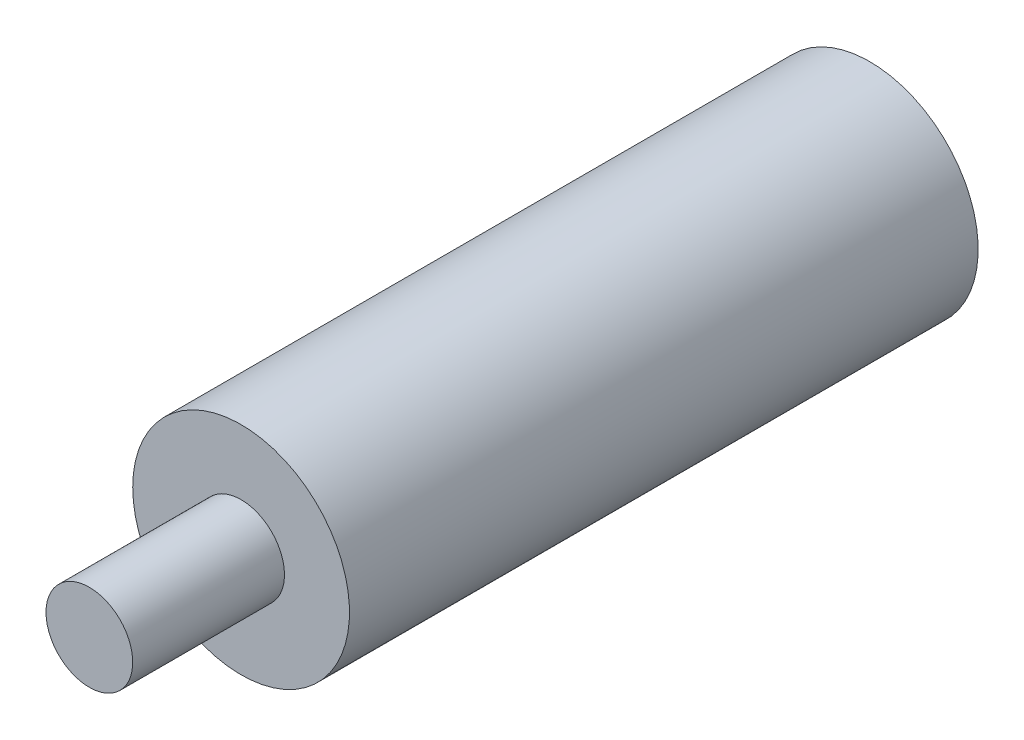
ISO-10303-21;
HEADER;
FILE_DESCRIPTION(('STEP AP214'),'2;1');
FILE_NAME('part.step','',(''),(''),'','','');
FILE_SCHEMA(('AUTOMOTIVE_DESIGN { 1 0 10303 214 1 1 1 1 }'));
ENDSEC;
DATA;
#1=APPLICATION_CONTEXT('core data for automotive mechanical design processes');
#2=APPLICATION_PROTOCOL_DEFINITION('international standard','automotive_design',2000,#1);
#3=PRODUCT_CONTEXT('',#1,'mechanical');
#4=PRODUCT('Part','Part','',(#3));
#5=PRODUCT_RELATED_PRODUCT_CATEGORY('part','',(#4));
#6=PRODUCT_DEFINITION_FORMATION('','',#4);
#7=PRODUCT_DEFINITION_CONTEXT('part definition',#1,'design');
#8=PRODUCT_DEFINITION('design','',#6,#7);
#9=PRODUCT_DEFINITION_SHAPE('','',#8);
#10=(LENGTH_UNIT() NAMED_UNIT(*) SI_UNIT(.MILLI.,.METRE.));
#11=(NAMED_UNIT(*) PLANE_ANGLE_UNIT() SI_UNIT($,.RADIAN.));
#12=(NAMED_UNIT(*) SI_UNIT($,.STERADIAN.) SOLID_ANGLE_UNIT());
#13=UNCERTAINTY_MEASURE_WITH_UNIT(LENGTH_MEASURE(1.E-05),#10,'distance_accuracy_value','');
#14=(GEOMETRIC_REPRESENTATION_CONTEXT(3) GLOBAL_UNCERTAINTY_ASSIGNED_CONTEXT((#13)) GLOBAL_UNIT_ASSIGNED_CONTEXT((#10,
#11,#12)) REPRESENTATION_CONTEXT('',''));
#15=CARTESIAN_POINT('',(0.,0.,0.));
#16=DIRECTION('',(0.,0.,1.));
#17=DIRECTION('',(1.,0.,0.));
#18=AXIS2_PLACEMENT_3D('',#15,#16,#17);
#19=CARTESIAN_POINT('',(0.,0.,0.));
#20=DIRECTION('',(0.,0.,1.));
#21=DIRECTION('',(1.,0.,0.));
#22=AXIS2_PLACEMENT_3D('',#19,#20,#21);
#23=PLANE('',#22);
#24=CARTESIAN_POINT('',(0.,0.,0.));
#25=DIRECTION('',(0.,0.,-1.));
#26=DIRECTION('',(-1.,0.,0.));
#27=AXIS2_PLACEMENT_3D('',#24,#25,#26);
#28=CIRCLE('',#27,9.99999999999998);
#29=CARTESIAN_POINT('',(-9.99999999999998,0.,0.));
#30=VERTEX_POINT('',#29);
#31=EDGE_CURVE('E10',#30,#30,#28,.T.);
#32=ORIENTED_EDGE('',*,*,#31,.F.);
#33=EDGE_LOOP('',(#32));
#34=FACE_BOUND('',#33,.T.);
#35=ADVANCED_FACE('F34',(#34),#23,.T.);
#36=CARTESIAN_POINT('',(0.,0.,-145.));
#37=DIRECTION('',(0.,0.,-1.));
#38=DIRECTION('',(-1.,0.,0.));
#39=AXIS2_PLACEMENT_3D('',#36,#37,#38);
#40=CYLINDRICAL_SURFACE('',#39,9.99999999999998);
#41=ORIENTED_EDGE('',*,*,#31,.T.);
#42=EDGE_LOOP('',(#41));
#43=FACE_BOUND('',#42,.T.);
#44=CARTESIAN_POINT('',(0.,0.,-35.));
#45=DIRECTION('',(0.,0.,-1.));
#46=DIRECTION('',(-1.,0.,0.));
#47=AXIS2_PLACEMENT_3D('',#44,#45,#46);
#48=CIRCLE('',#47,9.99999999999998);
#49=CARTESIAN_POINT('',(-9.99999999999998,0.,-35.));
#50=VERTEX_POINT('',#49);
#51=EDGE_CURVE('E41',#50,#50,#48,.T.);
#52=ORIENTED_EDGE('',*,*,#51,.F.);
#53=EDGE_LOOP('',(#52));
#54=FACE_BOUND('',#53,.T.);
#55=ADVANCED_FACE('F70',(#43,#54),#40,.T.);
#56=CARTESIAN_POINT('',(0.,9.99999999999998,-35.));
#57=DIRECTION('',(0.,0.,1.));
#58=DIRECTION('',(1.,0.,0.));
#59=AXIS2_PLACEMENT_3D('',#56,#57,#58);
#60=PLANE('',#59);
#61=ORIENTED_EDGE('',*,*,#51,.T.);
#62=EDGE_LOOP('',(#61));
#63=FACE_BOUND('',#62,.T.);
#64=CARTESIAN_POINT('',(0.,0.,-35.));
#65=DIRECTION('',(0.,0.,-1.));
#66=DIRECTION('',(-1.,0.,0.));
#67=AXIS2_PLACEMENT_3D('',#64,#65,#66);
#68=CIRCLE('',#67,25.);
#69=CARTESIAN_POINT('',(-25.,0.,-35.));
#70=VERTEX_POINT('',#69);
#71=EDGE_CURVE('E47',#70,#70,#68,.T.);
#72=ORIENTED_EDGE('',*,*,#71,.F.);
#73=EDGE_LOOP('',(#72));
#74=FACE_BOUND('',#73,.T.);
#75=ADVANCED_FACE('F62',(#63,#74),#60,.T.);
#76=CARTESIAN_POINT('',(0.,0.,-145.));
#77=DIRECTION('',(0.,0.,-1.));
#78=DIRECTION('',(-1.,0.,0.));
#79=AXIS2_PLACEMENT_3D('',#76,#77,#78);
#80=CYLINDRICAL_SURFACE('',#79,25.);
#81=ORIENTED_EDGE('',*,*,#71,.T.);
#82=EDGE_LOOP('',(#81));
#83=FACE_BOUND('',#82,.T.);
#84=CARTESIAN_POINT('',(0.,0.,-180.));
#85=DIRECTION('',(0.,0.,-1.));
#86=DIRECTION('',(-1.,0.,0.));
#87=AXIS2_PLACEMENT_3D('',#84,#85,#86);
#88=CIRCLE('',#87,25.);
#89=CARTESIAN_POINT('',(-25.,0.,-180.));
#90=VERTEX_POINT('',#89);
#91=EDGE_CURVE('E52',#90,#90,#88,.T.);
#92=ORIENTED_EDGE('',*,*,#91,.F.);
#93=EDGE_LOOP('',(#92));
#94=FACE_BOUND('',#93,.T.);
#95=ADVANCED_FACE('F60',(#83,#94),#80,.T.);
#96=CARTESIAN_POINT('',(0.,25.,-180.));
#97=DIRECTION('',(0.,0.,-1.));
#98=DIRECTION('',(-1.,0.,0.));
#99=AXIS2_PLACEMENT_3D('',#96,#97,#98);
#100=PLANE('',#99);
#101=ORIENTED_EDGE('',*,*,#91,.T.);
#102=EDGE_LOOP('',(#101));
#103=FACE_BOUND('',#102,.T.);
#104=ADVANCED_FACE('F58',(#103),#100,.T.);
#105=CLOSED_SHELL('',(#35,#55,#75,#95,#104));
#106=MANIFOLD_SOLID_BREP('B2',#105);
#107=ADVANCED_BREP_SHAPE_REPRESENTATION('',(#18,#106),#14);
#108=SHAPE_DEFINITION_REPRESENTATION(#9,#107);
ENDSEC;
END-ISO-10303-21;
